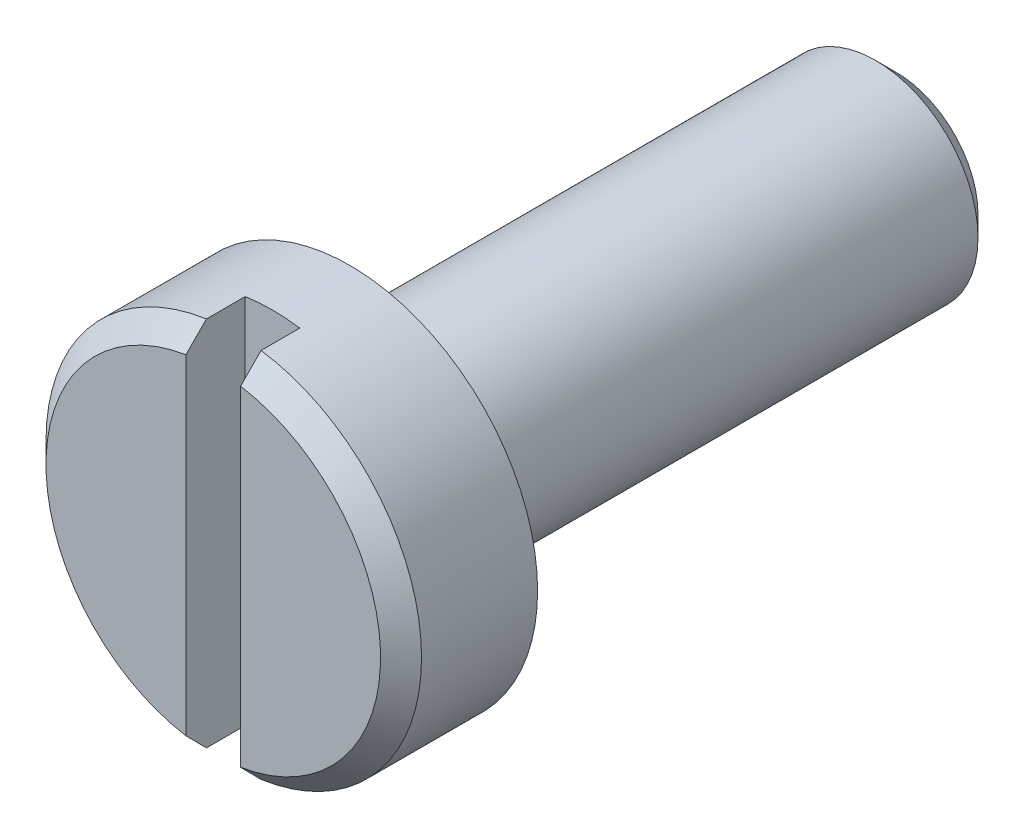
ISO-10303-21;
HEADER;
FILE_DESCRIPTION(('STEP AP214'),'2;1');
FILE_NAME('part.step','',(''),(''),'','','');
FILE_SCHEMA(('AUTOMOTIVE_DESIGN { 1 0 10303 214 1 1 1 1 }'));
ENDSEC;
DATA;
#1=APPLICATION_CONTEXT('core data for automotive mechanical design processes');
#2=APPLICATION_PROTOCOL_DEFINITION('international standard','automotive_design',2000,#1);
#3=PRODUCT_CONTEXT('',#1,'mechanical');
#4=PRODUCT('Part','Part','',(#3));
#5=PRODUCT_RELATED_PRODUCT_CATEGORY('part','',(#4));
#6=PRODUCT_DEFINITION_FORMATION('','',#4);
#7=PRODUCT_DEFINITION_CONTEXT('part definition',#1,'design');
#8=PRODUCT_DEFINITION('design','',#6,#7);
#9=PRODUCT_DEFINITION_SHAPE('','',#8);
#10=(LENGTH_UNIT() NAMED_UNIT(*) SI_UNIT(.MILLI.,.METRE.));
#11=(NAMED_UNIT(*) PLANE_ANGLE_UNIT() SI_UNIT($,.RADIAN.));
#12=(NAMED_UNIT(*) SI_UNIT($,.STERADIAN.) SOLID_ANGLE_UNIT());
#13=UNCERTAINTY_MEASURE_WITH_UNIT(LENGTH_MEASURE(1.E-05),#10,'distance_accuracy_value','');
#14=(GEOMETRIC_REPRESENTATION_CONTEXT(3) GLOBAL_UNCERTAINTY_ASSIGNED_CONTEXT((#13)) GLOBAL_UNIT_ASSIGNED_CONTEXT((#10,
#11,#12)) REPRESENTATION_CONTEXT('',''));
#15=CARTESIAN_POINT('',(0.,0.,0.));
#16=DIRECTION('',(0.,0.,1.));
#17=DIRECTION('',(1.,0.,0.));
#18=AXIS2_PLACEMENT_3D('',#15,#16,#17);
#19=CARTESIAN_POINT('',(0.,0.,2.));
#20=DIRECTION('',(0.,0.,1.));
#21=DIRECTION('',(1.,0.,0.));
#22=AXIS2_PLACEMENT_3D('',#19,#20,#21);
#23=PLANE('',#22);
#24=DIRECTION('',(0.,-1.,0.));
#25=VECTOR('',#24,1.);
#26=CARTESIAN_POINT('',(-0.4,0.,2.));
#27=LINE('',#26,#25);
#28=CARTESIAN_POINT('',(-0.4,2.41712639305436,2.));
#29=VERTEX_POINT('',#28);
#30=CARTESIAN_POINT('',(-0.4,-2.41712639305436,2.));
#31=VERTEX_POINT('',#30);
#32=EDGE_CURVE('E109',#29,#31,#27,.T.);
#33=ORIENTED_EDGE('',*,*,#32,.F.);
#34=CARTESIAN_POINT('',(0.,0.,2.));
#35=DIRECTION('',(0.,0.,1.));
#36=DIRECTION('',(1.,0.,0.));
#37=AXIS2_PLACEMENT_3D('',#34,#35,#36);
#38=CIRCLE('',#37,2.45);
#39=EDGE_CURVE('E133',#29,#31,#38,.T.);
#40=ORIENTED_EDGE('',*,*,#39,.T.);
#41=EDGE_LOOP('',(#33,#40));
#42=FACE_BOUND('',#41,.T.);
#43=ADVANCED_FACE('F34',(#42),#23,.T.);
#44=CARTESIAN_POINT('',(0.,0.,2.));
#45=DIRECTION('',(0.,0.,-1.));
#46=DIRECTION('',(-1.,0.,0.));
#47=AXIS2_PLACEMENT_3D('',#44,#45,#46);
#48=CONICAL_SURFACE('',#47,2.45,0.785398163397447);
#49=CARTESIAN_POINT('',(-0.4,6.04187900816897,-1.6051054449409));
#50=CARTESIAN_POINT('',(-0.4,5.83371761134153,-1.39740247856647));
#51=CARTESIAN_POINT('',(-0.4,5.62553628480856,-1.18971946726711));
#52=CARTESIAN_POINT('',(-0.4,5.20910350876452,-0.774415079748422));
#53=CARTESIAN_POINT('',(-0.4,5.00085205788208,-0.566793704904232));
#54=CARTESIAN_POINT('',(-0.4,4.58415907704699,-0.151544948861729));
#55=CARTESIAN_POINT('',(-0.4,4.37571750377377,0.0560823888685336));
#56=CARTESIAN_POINT('',(-0.4,3.95869973668701,0.47119339867415));
#57=CARTESIAN_POINT('',(-0.4,3.75012354569491,0.678677073582958));
#58=CARTESIAN_POINT('',(-0.4,3.33069138455204,1.09545876485019));
#59=CARTESIAN_POINT('',(-0.4,3.11983318358335,1.30475453627535));
#60=CARTESIAN_POINT('',(-0.4,2.69770631030097,1.72295751502337));
#61=CARTESIAN_POINT('',(-0.4,2.48643761424796,1.93186469841837));
#62=CARTESIAN_POINT('',(-0.4,2.16893930210293,2.2445586007645));
#63=CARTESIAN_POINT('',(-0.4,2.06302312692581,2.34866331265257));
#64=CARTESIAN_POINT('',(-0.4,1.85085482225619,2.55653499003892));
#65=CARTESIAN_POINT('',(-0.4,1.74460268475393,2.66030194736317));
#66=CARTESIAN_POINT('',(-0.4,1.53156707578725,2.86726743009411));
#67=CARTESIAN_POINT('',(-0.4,1.42478366438056,2.97046601709266));
#68=CARTESIAN_POINT('',(-0.4,1.26384149335063,3.12445874517987));
#69=CARTESIAN_POINT('',(-0.4,1.21006731503438,3.17565447362706));
#70=CARTESIAN_POINT('',(-0.4,1.10214437340176,3.27764920435929));
#71=CARTESIAN_POINT('',(-0.4,1.0479956153971,3.32844821224835));
#72=CARTESIAN_POINT('',(-0.4,0.964010735540216,3.40635423578765));
#73=CARTESIAN_POINT('',(-0.4,0.934374982270666,3.43367706635221));
#74=CARTESIAN_POINT('',(-0.4,0.874885297516143,3.48808564797148));
#75=CARTESIAN_POINT('',(-0.4,0.845031361188339,3.51517139373432));
#76=CARTESIAN_POINT('',(-0.4,0.78504052476308,3.56902730837041));
#77=CARTESIAN_POINT('',(-0.4,0.754903633292135,3.59579748680867));
#78=CARTESIAN_POINT('',(-0.4,0.694247271266361,3.64889639544466));
#79=CARTESIAN_POINT('',(-0.4,0.66372781824361,3.67522514574389));
#80=CARTESIAN_POINT('',(-0.4,0.586591375184734,3.74045098232361));
#81=CARTESIAN_POINT('',(-0.4,0.539643805134426,3.77896587711857));
#82=CARTESIAN_POINT('',(-0.4,0.467669192218729,3.83478412238802));
#83=CARTESIAN_POINT('',(-0.4,0.443409126824378,3.85307119330014));
#84=CARTESIAN_POINT('',(-0.4,0.394186586002638,3.88866865550253));
#85=CARTESIAN_POINT('',(-0.4,0.369224317075958,3.9059793295187));
#86=CARTESIAN_POINT('',(-0.4,0.3136120866858,3.94223590583443));
#87=CARTESIAN_POINT('',(-0.4,0.282767282170436,3.96088778436171));
#88=CARTESIAN_POINT('',(-0.4,0.219169630242059,3.99468611329902));
#89=CARTESIAN_POINT('',(-0.4,0.186420173057591,4.00983856715097));
#90=CARTESIAN_POINT('',(-0.4,0.12913868886998,4.03023322241156));
#91=CARTESIAN_POINT('',(-0.4,0.105204877784475,4.03709138255113));
#92=CARTESIAN_POINT('',(-0.4,0.0565642141307101,4.04671672813724));
#93=CARTESIAN_POINT('',(-0.4,0.031860366125749,4.0494981726038));
#94=CARTESIAN_POINT('',(-0.4,-0.0177585220230636,4.05037755095694));
#95=CARTESIAN_POINT('',(-0.4,-0.0426740027748081,4.0484523065437));
#96=CARTESIAN_POINT('',(-0.4,-0.0918173310269223,4.04032153079189));
#97=CARTESIAN_POINT('',(-0.4,-0.116043150706105,4.03410451086266));
#98=CARTESIAN_POINT('',(-0.4,-0.164302837173598,4.01819687939));
#99=CARTESIAN_POINT('',(-0.4,-0.188294057076781,4.00838270309725));
#100=CARTESIAN_POINT('',(-0.4,-0.235209065806348,3.9864350553176));
#101=CARTESIAN_POINT('',(-0.4,-0.258130817009085,3.9742973647177));
#102=CARTESIAN_POINT('',(-0.4,-0.303259708530746,3.94838011910795));
#103=CARTESIAN_POINT('',(-0.4,-0.325459470587701,3.93458794713976));
#104=CARTESIAN_POINT('',(-0.4,-0.36913299786487,3.90595054324435));
#105=CARTESIAN_POINT('',(-0.4,-0.390607369173691,3.89110622425395));
#106=CARTESIAN_POINT('',(-0.4,-0.45791385861542,3.84284418080121));
#107=CARTESIAN_POINT('',(-0.4,-0.502764562619795,3.80806822868961));
#108=CARTESIAN_POINT('',(-0.4,-0.591064708773701,3.73677034252187));
#109=CARTESIAN_POINT('',(-0.4,-0.634513213782467,3.70024727968323));
#110=CARTESIAN_POINT('',(-0.4,-0.720606835455306,3.62611033861201));
#111=CARTESIAN_POINT('',(-0.4,-0.763250336426255,3.5884945865115));
#112=CARTESIAN_POINT('',(-0.4,-0.847944798158296,3.51263083240032));
#113=CARTESIAN_POINT('',(-0.4,-0.889995928352692,3.47438301826866));
#114=CARTESIAN_POINT('',(-0.4,-1.01531389383745,3.35923883098576));
#115=CARTESIAN_POINT('',(-0.4,-1.0980027576958,3.2817145534827));
#116=CARTESIAN_POINT('',(-0.4,-1.26249153577641,3.12591042267968));
#117=CARTESIAN_POINT('',(-0.4,-1.34429230662357,3.04763146675772));
#118=CARTESIAN_POINT('',(-0.4,-1.50703075959251,2.89094265583899));
#119=CARTESIAN_POINT('',(-0.4,-1.58797069024883,2.81253513610639));
#120=CARTESIAN_POINT('',(-0.4,-1.74954638599776,2.6554071379473));
#121=CARTESIAN_POINT('',(-0.4,-1.83018214965268,2.57668665804515));
#122=CARTESIAN_POINT('',(-0.4,-2.07178945948893,2.34021253319591));
#123=CARTESIAN_POINT('',(-0.4,-2.23245784751782,2.18214928089957));
#124=CARTESIAN_POINT('',(-0.4,-2.55345283015736,1.86553776193391));
#125=CARTESIAN_POINT('',(-0.4,-2.71377924612677,1.70698931451159));
#126=CARTESIAN_POINT('',(-0.4,-3.0341828116127,1.38964374748758));
#127=CARTESIAN_POINT('',(-0.4,-3.19425996344284,1.23084663022178));
#128=CARTESIAN_POINT('',(-0.4,-3.67424143851151,0.754247024838234));
#129=CARTESIAN_POINT('',(-0.4,-3.99391752213846,0.436214778046683));
#130=CARTESIAN_POINT('',(-0.4,-4.63295297265027,-0.200099271816898));
#131=CARTESIAN_POINT('',(-0.4,-4.95231236974114,-0.518381044574306));
#132=CARTESIAN_POINT('',(-0.4,-5.39999718674831,-0.964783190767283));
#133=CARTESIAN_POINT('',(-0.4,-5.52839076585865,-1.092835210411));
#134=CARTESIAN_POINT('',(-0.4,-5.7851521117363,-1.34895708361291));
#135=CARTESIAN_POINT('',(-0.4,-5.91351987918619,-1.47702693648681));
#136=CARTESIAN_POINT('',(-0.4,-6.04187900816897,-1.6051054449409));
#137=B_SPLINE_CURVE_WITH_KNOTS('',3,(#49,#50,#51,#52,#53,#54,#55,#56,#57,#58,#59,#60,#61,#62,
#63,#64,#65,#66,#67,#68,#69,#70,#71,#72,#73,#74,#75,#76,#77,#78,#79,#80,#81,#82,#83,#84,#85,#86,
#87,#88,#89,#90,#91,#92,#93,#94,#95,#96,#97,#98,#99,#100,#101,#102,#103,#104,#105,#106,#107,
#108,#109,#110,#111,#112,#113,#114,#115,#116,#117,#118,#119,#120,#121,#122,#123,#124,#125,#126,
#127,#128,#129,#130,#131,#132,#133,#134,#135,#136),.UNSPECIFIED.,.F.,.F.,(4,2,2,2,2,2,2,2,2,2,2,
2,2,2,2,2,2,2,2,2,2,2,2,2,2,2,2,2,2,2,2,2,2,2,2,2,2,2,2,2,2,2,2,4),(0.,0.882182089326142,
1.76438256919672,2.64699967204617,3.52959884078872,4.42088602139292,5.31222637874963,
5.75776396592013,6.20331225657681,6.64881127562903,6.8715521126422,7.09428979754251,
7.21521575904141,7.33614441283596,7.45706939174955,7.57798884901338,7.76009923429503,
7.85122470701069,7.94232365648788,8.05035365734661,8.15819692722299,8.23262309568975,
8.3067883193182,8.381319507947,8.45605098561628,8.53363585186422,8.61136295901567,
8.68972580225041,8.76802146416196,8.93817550911792,9.10844101338494,9.27901810135843,
9.44954536654297,9.78957010149457,10.1292309530246,10.4672989852871,10.8053686134917,
11.4815211398511,12.1579671726473,12.8344068889024,14.1871945818618,15.5398376502782,
16.0838413954937,16.6278280999355),.UNSPECIFIED.);
#138=CARTESIAN_POINT('',(-0.4,2.72075357208256,1.7));
#139=VERTEX_POINT('',#138);
#140=EDGE_CURVE('E190',#139,#29,#137,.T.);
#141=ORIENTED_EDGE('',*,*,#140,.F.);
#142=CARTESIAN_POINT('',(0.,0.,1.7));
#143=DIRECTION('',(0.,0.,1.));
#144=DIRECTION('',(1.,0.,0.));
#145=AXIS2_PLACEMENT_3D('',#142,#143,#144);
#146=CIRCLE('',#145,2.75);
#147=CARTESIAN_POINT('',(-0.4,-2.72075357208256,1.7));
#148=VERTEX_POINT('',#147);
#149=EDGE_CURVE('E135',#148,#139,#146,.F.);
#150=ORIENTED_EDGE('',*,*,#149,.F.);
#151=EDGE_CURVE('E142',#31,#148,#137,.T.);
#152=ORIENTED_EDGE('',*,*,#151,.F.);
#153=ORIENTED_EDGE('',*,*,#39,.F.);
#154=EDGE_LOOP('',(#141,#150,#152,#153));
#155=FACE_BOUND('',#154,.T.);
#156=ADVANCED_FACE('F169',(#155),#48,.T.);
#157=CARTESIAN_POINT('',(0.,0.,-8.));
#158=DIRECTION('',(0.,0.,1.));
#159=DIRECTION('',(1.,0.,0.));
#160=AXIS2_PLACEMENT_3D('',#157,#158,#159);
#161=CYLINDRICAL_SURFACE('',#160,1.5);
#162=CARTESIAN_POINT('',(0.,0.,-7.7));
#163=DIRECTION('',(0.,0.,1.));
#164=DIRECTION('',(1.,0.,0.));
#165=AXIS2_PLACEMENT_3D('',#162,#163,#164);
#166=CIRCLE('',#165,1.5);
#167=CARTESIAN_POINT('',(1.5,0.,-7.7));
#168=VERTEX_POINT('',#167);
#169=EDGE_CURVE('E124',#168,#168,#166,.T.);
#170=ORIENTED_EDGE('',*,*,#169,.T.);
#171=EDGE_LOOP('',(#170));
#172=FACE_BOUND('',#171,.T.);
#173=CARTESIAN_POINT('',(0.,0.,0.));
#174=DIRECTION('',(0.,0.,1.));
#175=DIRECTION('',(1.,0.,0.));
#176=AXIS2_PLACEMENT_3D('',#173,#174,#175);
#177=CIRCLE('',#176,1.5);
#178=CARTESIAN_POINT('',(1.5,0.,0.));
#179=VERTEX_POINT('',#178);
#180=EDGE_CURVE('E121',#179,#179,#177,.T.);
#181=ORIENTED_EDGE('',*,*,#180,.F.);
#182=EDGE_LOOP('',(#181));
#183=FACE_BOUND('',#182,.T.);
#184=ADVANCED_FACE('F166',(#172,#183),#161,.T.);
#185=CARTESIAN_POINT('',(0.,0.,-8.));
#186=DIRECTION('',(0.,0.,1.));
#187=DIRECTION('',(1.,0.,0.));
#188=AXIS2_PLACEMENT_3D('',#185,#186,#187);
#189=PLANE('',#188);
#190=CARTESIAN_POINT('',(0.,0.,-8.));
#191=DIRECTION('',(0.,0.,1.));
#192=DIRECTION('',(1.,0.,0.));
#193=AXIS2_PLACEMENT_3D('',#190,#191,#192);
#194=CIRCLE('',#193,1.2);
#195=CARTESIAN_POINT('',(1.2,0.,-8.));
#196=VERTEX_POINT('',#195);
#197=EDGE_CURVE('E127',#196,#196,#194,.F.);
#198=ORIENTED_EDGE('',*,*,#197,.T.);
#199=EDGE_LOOP('',(#198));
#200=FACE_BOUND('',#199,.T.);
#201=ADVANCED_FACE('F163',(#200),#189,.F.);
#202=CARTESIAN_POINT('',(0.,0.,2.));
#203=DIRECTION('',(0.,0.,-1.));
#204=DIRECTION('',(-1.,0.,0.));
#205=AXIS2_PLACEMENT_3D('',#202,#203,#204);
#206=CYLINDRICAL_SURFACE('',#205,2.75);
#207=ORIENTED_EDGE('',*,*,#149,.T.);
#208=DIRECTION('',(0.,0.,-1.));
#209=VECTOR('',#208,1.);
#210=CARTESIAN_POINT('',(-0.4,2.72075357208256,2.));
#211=LINE('',#210,#209);
#212=CARTESIAN_POINT('',(-0.4,2.72075357208256,1.13273808557404));
#213=VERTEX_POINT('',#212);
#214=EDGE_CURVE('E58',#139,#213,#211,.T.);
#215=ORIENTED_EDGE('',*,*,#214,.T.);
#216=CARTESIAN_POINT('',(0.,0.,1.13273808557404));
#217=DIRECTION('',(0.,0.,-1.));
#218=DIRECTION('',(-1.,0.,0.));
#219=AXIS2_PLACEMENT_3D('',#216,#217,#218);
#220=CIRCLE('',#219,2.75);
#221=CARTESIAN_POINT('',(0.4,2.72075357208256,1.13273808557404));
#222=VERTEX_POINT('',#221);
#223=EDGE_CURVE('E39',#213,#222,#220,.T.);
#224=ORIENTED_EDGE('',*,*,#223,.T.);
#225=DIRECTION('',(0.,0.,-1.));
#226=VECTOR('',#225,1.);
#227=CARTESIAN_POINT('',(0.4,2.72075357208256,2.));
#228=LINE('',#227,#226);
#229=CARTESIAN_POINT('',(0.4,2.72075357208256,1.7));
#230=VERTEX_POINT('',#229);
#231=EDGE_CURVE('E101',#222,#230,#228,.F.);
#232=ORIENTED_EDGE('',*,*,#231,.T.);
#233=CARTESIAN_POINT('',(0.4,-2.72075357208256,1.7));
#234=VERTEX_POINT('',#233);
#235=EDGE_CURVE('E108',#230,#234,#146,.F.);
#236=ORIENTED_EDGE('',*,*,#235,.T.);
#237=DIRECTION('',(0.,0.,-1.));
#238=VECTOR('',#237,1.);
#239=CARTESIAN_POINT('',(0.4,-2.72075357208256,2.));
#240=LINE('',#239,#238);
#241=CARTESIAN_POINT('',(0.4,-2.72075357208256,1.13273808557404));
#242=VERTEX_POINT('',#241);
#243=EDGE_CURVE('E98',#234,#242,#240,.T.);
#244=ORIENTED_EDGE('',*,*,#243,.T.);
#245=CARTESIAN_POINT('',(-0.4,-2.72075357208256,1.13273808557404));
#246=VERTEX_POINT('',#245);
#247=EDGE_CURVE('E11',#242,#246,#220,.T.);
#248=ORIENTED_EDGE('',*,*,#247,.T.);
#249=DIRECTION('',(0.,0.,-1.));
#250=VECTOR('',#249,1.);
#251=CARTESIAN_POINT('',(-0.4,-2.72075357208256,2.));
#252=LINE('',#251,#250);
#253=EDGE_CURVE('E111',#246,#148,#252,.F.);
#254=ORIENTED_EDGE('',*,*,#253,.T.);
#255=EDGE_LOOP('',(#207,#215,#224,#232,#236,#244,#248,#254));
#256=FACE_BOUND('',#255,.T.);
#257=CARTESIAN_POINT('',(0.,0.,0.));
#258=DIRECTION('',(0.,0.,1.));
#259=DIRECTION('',(1.,0.,0.));
#260=AXIS2_PLACEMENT_3D('',#257,#258,#259);
#261=CIRCLE('',#260,2.75);
#262=CARTESIAN_POINT('',(2.75,0.,0.));
#263=VERTEX_POINT('',#262);
#264=EDGE_CURVE('E118',#263,#263,#261,.T.);
#265=ORIENTED_EDGE('',*,*,#264,.T.);
#266=EDGE_LOOP('',(#265));
#267=FACE_BOUND('',#266,.T.);
#268=ADVANCED_FACE('F105',(#256,#267),#206,.T.);
#269=DIRECTION('',(0.,1.,0.));
#270=VECTOR('',#269,1.);
#271=CARTESIAN_POINT('',(0.4,0.,2.));
#272=LINE('',#271,#270);
#273=CARTESIAN_POINT('',(0.4,-2.41712639305436,2.));
#274=VERTEX_POINT('',#273);
#275=CARTESIAN_POINT('',(0.4,2.41712639305436,2.));
#276=VERTEX_POINT('',#275);
#277=EDGE_CURVE('E50',#274,#276,#272,.T.);
#278=ORIENTED_EDGE('',*,*,#277,.F.);
#279=EDGE_CURVE('E130',#274,#276,#38,.T.);
#280=ORIENTED_EDGE('',*,*,#279,.T.);
#281=EDGE_LOOP('',(#278,#280));
#282=FACE_BOUND('',#281,.T.);
#283=ADVANCED_FACE('F152',(#282),#23,.T.);
#284=CARTESIAN_POINT('',(0.,0.,0.));
#285=DIRECTION('',(0.,0.,1.));
#286=DIRECTION('',(1.,0.,0.));
#287=AXIS2_PLACEMENT_3D('',#284,#285,#286);
#288=PLANE('',#287);
#289=ORIENTED_EDGE('',*,*,#180,.T.);
#290=EDGE_LOOP('',(#289));
#291=FACE_BOUND('',#290,.T.);
#292=ORIENTED_EDGE('',*,*,#264,.F.);
#293=EDGE_LOOP('',(#292));
#294=FACE_BOUND('',#293,.T.);
#295=ADVANCED_FACE('F155',(#291,#294),#288,.F.);
#296=CARTESIAN_POINT('',(0.,0.,-7.7));
#297=DIRECTION('',(0.,0.,1.));
#298=DIRECTION('',(1.,0.,0.));
#299=AXIS2_PLACEMENT_3D('',#296,#297,#298);
#300=CONICAL_SURFACE('',#299,1.5,0.785398163397454);
#301=ORIENTED_EDGE('',*,*,#197,.F.);
#302=EDGE_LOOP('',(#301));
#303=FACE_BOUND('',#302,.T.);
#304=ORIENTED_EDGE('',*,*,#169,.F.);
#305=EDGE_LOOP('',(#304));
#306=FACE_BOUND('',#305,.T.);
#307=ADVANCED_FACE('F159',(#303,#306),#300,.T.);
#308=CARTESIAN_POINT('',(0.4,-6.04187900816897,-1.6051054449409));
#309=CARTESIAN_POINT('',(0.4,-5.83371761134153,-1.39740247856647));
#310=CARTESIAN_POINT('',(0.4,-5.62553628480857,-1.18971946726711));
#311=CARTESIAN_POINT('',(0.4,-5.20910350876452,-0.774415079748424));
#312=CARTESIAN_POINT('',(0.4,-5.00085205788208,-0.566793704904235));
#313=CARTESIAN_POINT('',(0.4,-4.58415907704699,-0.151544948861733));
#314=CARTESIAN_POINT('',(0.4,-4.37571750377378,0.05608238886853));
#315=CARTESIAN_POINT('',(0.4,-3.95869973668701,0.471193398674146));
#316=CARTESIAN_POINT('',(0.4,-3.75012354569491,0.678677073582952));
#317=CARTESIAN_POINT('',(0.4,-3.33069138455205,1.09545876485019));
#318=CARTESIAN_POINT('',(0.4,-3.11983318358336,1.30475453627534));
#319=CARTESIAN_POINT('',(0.4,-2.69770631030097,1.72295751502337));
#320=CARTESIAN_POINT('',(0.4,-2.48643761424796,1.93186469841836));
#321=CARTESIAN_POINT('',(0.4,-2.16893930210294,2.24455860076449));
#322=CARTESIAN_POINT('',(0.4,-2.06302312692581,2.34866331265257));
#323=CARTESIAN_POINT('',(0.4,-1.85085482225619,2.55653499003891));
#324=CARTESIAN_POINT('',(0.4,-1.74460268475394,2.66030194736317));
#325=CARTESIAN_POINT('',(0.4,-1.53156707578726,2.86726743009411));
#326=CARTESIAN_POINT('',(0.4,-1.42478366438056,2.97046601709266));
#327=CARTESIAN_POINT('',(0.4,-1.26384149335063,3.12445874517987));
#328=CARTESIAN_POINT('',(0.4,-1.21006731503438,3.17565447362706));
#329=CARTESIAN_POINT('',(0.4,-1.10214437340176,3.27764920435929));
#330=CARTESIAN_POINT('',(0.4,-1.0479956153971,3.32844821224835));
#331=CARTESIAN_POINT('',(0.4,-0.964010735540217,3.40635423578764));
#332=CARTESIAN_POINT('',(0.4,-0.934374982270667,3.4336770663522));
#333=CARTESIAN_POINT('',(0.4,-0.874885297516143,3.48808564797148));
#334=CARTESIAN_POINT('',(0.4,-0.845031361188339,3.51517139373432));
#335=CARTESIAN_POINT('',(0.4,-0.785040524763081,3.56902730837041));
#336=CARTESIAN_POINT('',(0.4,-0.754903633292135,3.59579748680867));
#337=CARTESIAN_POINT('',(0.4,-0.694247271266361,3.64889639544465));
#338=CARTESIAN_POINT('',(0.4,-0.66372781824361,3.67522514574389));
#339=CARTESIAN_POINT('',(0.4,-0.586591375184734,3.74045098232361));
#340=CARTESIAN_POINT('',(0.4,-0.539643805134426,3.77896587711857));
#341=CARTESIAN_POINT('',(0.4,-0.467669192218729,3.83478412238802));
#342=CARTESIAN_POINT('',(0.4,-0.443409126824378,3.85307119330014));
#343=CARTESIAN_POINT('',(0.4,-0.394186586002639,3.88866865550253));
#344=CARTESIAN_POINT('',(0.4,-0.369224317075958,3.9059793295187));
#345=CARTESIAN_POINT('',(0.4,-0.313612086685801,3.94223590583443));
#346=CARTESIAN_POINT('',(0.4,-0.282767282170437,3.96088778436171));
#347=CARTESIAN_POINT('',(0.4,-0.21916963024206,3.99468611329902));
#348=CARTESIAN_POINT('',(0.4,-0.186420173057592,4.00983856715097));
#349=CARTESIAN_POINT('',(0.4,-0.12913868886998,4.03023322241156));
#350=CARTESIAN_POINT('',(0.4,-0.105204877784476,4.03709138255113));
#351=CARTESIAN_POINT('',(0.4,-0.0565642141307104,4.04671672813724));
#352=CARTESIAN_POINT('',(0.4,-0.0318603661257493,4.0494981726038));
#353=CARTESIAN_POINT('',(0.4,0.0177585220230633,4.05037755095694));
#354=CARTESIAN_POINT('',(0.4,0.0426740027748078,4.0484523065437));
#355=CARTESIAN_POINT('',(0.4,0.0918173310269219,4.04032153079189));
#356=CARTESIAN_POINT('',(0.4,0.116043150706104,4.03410451086266));
#357=CARTESIAN_POINT('',(0.4,0.164302837173598,4.01819687939));
#358=CARTESIAN_POINT('',(0.4,0.188294057076781,4.00838270309725));
#359=CARTESIAN_POINT('',(0.4,0.235209065806347,3.9864350553176));
#360=CARTESIAN_POINT('',(0.4,0.258130817009084,3.9742973647177));
#361=CARTESIAN_POINT('',(0.4,0.303259708530745,3.94838011910795));
#362=CARTESIAN_POINT('',(0.4,0.3254594705877,3.93458794713976));
#363=CARTESIAN_POINT('',(0.4,0.369132997864869,3.90595054324435));
#364=CARTESIAN_POINT('',(0.4,0.39060736917369,3.89110622425395));
#365=CARTESIAN_POINT('',(0.4,0.457913858615419,3.84284418080121));
#366=CARTESIAN_POINT('',(0.4,0.502764562619794,3.80806822868961));
#367=CARTESIAN_POINT('',(0.4,0.591064708773699,3.73677034252187));
#368=CARTESIAN_POINT('',(0.4,0.634513213782465,3.70024727968324));
#369=CARTESIAN_POINT('',(0.4,0.720606835455304,3.62611033861201));
#370=CARTESIAN_POINT('',(0.4,0.763250336426253,3.58849458651151));
#371=CARTESIAN_POINT('',(0.4,0.847944798158295,3.51263083240033));
#372=CARTESIAN_POINT('',(0.4,0.88999592835269,3.47438301826866));
#373=CARTESIAN_POINT('',(0.4,1.01531389383745,3.35923883098577));
#374=CARTESIAN_POINT('',(0.4,1.09800275769579,3.28171455348271));
#375=CARTESIAN_POINT('',(0.4,1.26249153577641,3.12591042267969));
#376=CARTESIAN_POINT('',(0.4,1.34429230662357,3.04763146675772));
#377=CARTESIAN_POINT('',(0.4,1.50703075959251,2.890942655839));
#378=CARTESIAN_POINT('',(0.4,1.58797069024882,2.81253513610639));
#379=CARTESIAN_POINT('',(0.4,1.74954638599776,2.6554071379473));
#380=CARTESIAN_POINT('',(0.4,1.83018214965268,2.57668665804516));
#381=CARTESIAN_POINT('',(0.4,2.07178945948892,2.34021253319592));
#382=CARTESIAN_POINT('',(0.4,2.23245784751781,2.18214928089958));
#383=CARTESIAN_POINT('',(0.4,2.55345283015735,1.86553776193392));
#384=CARTESIAN_POINT('',(0.4,2.71377924612676,1.7069893145116));
#385=CARTESIAN_POINT('',(0.4,3.03418281161269,1.38964374748759));
#386=CARTESIAN_POINT('',(0.4,3.19425996344283,1.23084663022179));
#387=CARTESIAN_POINT('',(0.4,3.6742414385115,0.754247024838246));
#388=CARTESIAN_POINT('',(0.4,3.99391752213845,0.436214778046696));
#389=CARTESIAN_POINT('',(0.4,4.63295297265026,-0.200099271816884));
#390=CARTESIAN_POINT('',(0.4,4.95231236974112,-0.51838104457429));
#391=CARTESIAN_POINT('',(0.4,5.3999971867483,-0.964783190767269));
#392=CARTESIAN_POINT('',(0.4,5.52839076585864,-1.09283521041099));
#393=CARTESIAN_POINT('',(0.4,5.7851521117363,-1.34895708361291));
#394=CARTESIAN_POINT('',(0.4,5.91351987918618,-1.47702693648681));
#395=CARTESIAN_POINT('',(0.4,6.04187900816896,-1.6051054449409));
#396=B_SPLINE_CURVE_WITH_KNOTS('',3,(#308,#309,#310,#311,#312,#313,#314,#315,#316,#317,#318,
#319,#320,#321,#322,#323,#324,#325,#326,#327,#328,#329,#330,#331,#332,#333,#334,#335,#336,#337,
#338,#339,#340,#341,#342,#343,#344,#345,#346,#347,#348,#349,#350,#351,#352,#353,#354,#355,#356,
#357,#358,#359,#360,#361,#362,#363,#364,#365,#366,#367,#368,#369,#370,#371,#372,#373,#374,#375,
#376,#377,#378,#379,#380,#381,#382,#383,#384,#385,#386,#387,#388,#389,#390,#391,#392,#393,#394,
#395),.UNSPECIFIED.,.F.,.F.,(4,2,2,2,2,2,2,2,2,2,2,2,2,2,2,2,2,2,2,2,2,2,2,2,2,2,2,2,2,2,2,2,2,
2,2,2,2,2,2,2,2,2,2,4),(0.,0.882182089326139,1.76438256919672,2.64699967204616,3.52959884078872,
4.42088602139291,5.31222637874962,5.75776396592013,6.20331225657681,6.64881127562903,
6.87155211264219,7.09428979754251,7.21521575904141,7.33614441283596,7.45706939174955,
7.57798884901338,7.76009923429502,7.85122470701069,7.94232365648788,8.0503536573466,
8.15819692722299,8.23262309568975,8.3067883193182,8.381319507947,8.45605098561628,
8.53363585186422,8.61136295901567,8.68972580225041,8.76802146416196,8.93817550911792,
9.10844101338494,9.27901810135842,9.44954536654296,9.78957010149457,10.1292309530245,
10.467298985287,10.8053686134917,11.4815211398511,12.1579671726472,12.8344068889024,
14.1871945818618,15.5398376502781,16.0838413954937,16.6278280999355),.UNSPECIFIED.);
#397=EDGE_CURVE('E141',#234,#274,#396,.T.);
#398=ORIENTED_EDGE('',*,*,#397,.F.);
#399=ORIENTED_EDGE('',*,*,#235,.F.);
#400=EDGE_CURVE('E136',#276,#230,#396,.T.);
#401=ORIENTED_EDGE('',*,*,#400,.F.);
#402=ORIENTED_EDGE('',*,*,#279,.F.);
#403=EDGE_LOOP('',(#398,#399,#401,#402));
#404=FACE_BOUND('',#403,.T.);
#405=ADVANCED_FACE('F36',(#404),#48,.T.);
#406=CARTESIAN_POINT('',(0.4,-2.75,1.13273808557404));
#407=DIRECTION('',(0.,0.,-1.));
#408=DIRECTION('',(-1.,0.,0.));
#409=AXIS2_PLACEMENT_3D('',#406,#407,#408);
#410=PLANE('',#409);
#411=DIRECTION('',(0.,1.,0.));
#412=VECTOR('',#411,1.);
#413=CARTESIAN_POINT('',(-0.4,-2.75,1.13273808557404));
#414=LINE('',#413,#412);
#415=EDGE_CURVE('E93',#246,#213,#414,.T.);
#416=ORIENTED_EDGE('',*,*,#415,.F.);
#417=ORIENTED_EDGE('',*,*,#247,.F.);
#418=DIRECTION('',(0.,1.,0.));
#419=VECTOR('',#418,1.);
#420=CARTESIAN_POINT('',(0.4,-2.75,1.13273808557404));
#421=LINE('',#420,#419);
#422=EDGE_CURVE('E91',#242,#222,#421,.T.);
#423=ORIENTED_EDGE('',*,*,#422,.T.);
#424=ORIENTED_EDGE('',*,*,#223,.F.);
#425=EDGE_LOOP('',(#416,#417,#423,#424));
#426=FACE_BOUND('',#425,.T.);
#427=ADVANCED_FACE('F90',(#426),#410,.F.);
#428=CARTESIAN_POINT('',(-0.4,-2.75,2.83273808557404));
#429=DIRECTION('',(-1.,0.,0.));
#430=DIRECTION('',(0.,0.,1.));
#431=AXIS2_PLACEMENT_3D('',#428,#429,#430);
#432=PLANE('',#431);
#433=ORIENTED_EDGE('',*,*,#140,.T.);
#434=ORIENTED_EDGE('',*,*,#32,.T.);
#435=ORIENTED_EDGE('',*,*,#151,.T.);
#436=ORIENTED_EDGE('',*,*,#253,.F.);
#437=ORIENTED_EDGE('',*,*,#415,.T.);
#438=ORIENTED_EDGE('',*,*,#214,.F.);
#439=EDGE_LOOP('',(#433,#434,#435,#436,#437,#438));
#440=FACE_BOUND('',#439,.T.);
#441=ADVANCED_FACE('F151',(#440),#432,.F.);
#442=CARTESIAN_POINT('',(0.4,-2.75,2.83273808557404));
#443=DIRECTION('',(1.,0.,0.));
#444=DIRECTION('',(0.,0.,-1.));
#445=AXIS2_PLACEMENT_3D('',#442,#443,#444);
#446=PLANE('',#445);
#447=ORIENTED_EDGE('',*,*,#397,.T.);
#448=ORIENTED_EDGE('',*,*,#277,.T.);
#449=ORIENTED_EDGE('',*,*,#400,.T.);
#450=ORIENTED_EDGE('',*,*,#231,.F.);
#451=ORIENTED_EDGE('',*,*,#422,.F.);
#452=ORIENTED_EDGE('',*,*,#243,.F.);
#453=EDGE_LOOP('',(#447,#448,#449,#450,#451,#452));
#454=FACE_BOUND('',#453,.T.);
#455=ADVANCED_FACE('F97',(#454),#446,.F.);
#456=CLOSED_SHELL('',(#43,#156,#184,#201,#268,#283,#295,#307,#405,#427,#441,#455));
#457=MANIFOLD_SOLID_BREP('B2',#456);
#458=ADVANCED_BREP_SHAPE_REPRESENTATION('',(#18,#457),#14);
#459=SHAPE_DEFINITION_REPRESENTATION(#9,#458);
ENDSEC;
END-ISO-10303-21;
